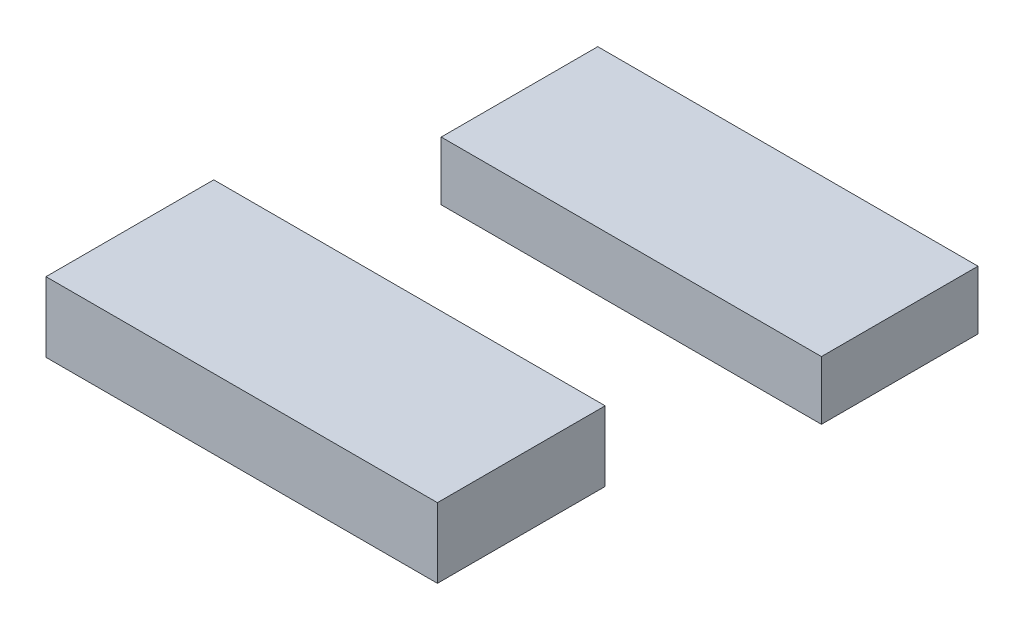
ISO-10303-21;
HEADER;
FILE_DESCRIPTION(('STEP AP214'),'2;1');
FILE_NAME('part.step','',(''),(''),'','','');
FILE_SCHEMA(('AUTOMOTIVE_DESIGN { 1 0 10303 214 1 1 1 1 }'));
ENDSEC;
DATA;
#1=APPLICATION_CONTEXT('core data for automotive mechanical design processes');
#2=APPLICATION_PROTOCOL_DEFINITION('international standard','automotive_design',2000,#1);
#3=PRODUCT_CONTEXT('',#1,'mechanical');
#4=PRODUCT('Part','Part','',(#3));
#5=PRODUCT_RELATED_PRODUCT_CATEGORY('part','',(#4));
#6=PRODUCT_DEFINITION_FORMATION('','',#4);
#7=PRODUCT_DEFINITION_CONTEXT('part definition',#1,'design');
#8=PRODUCT_DEFINITION('design','',#6,#7);
#9=PRODUCT_DEFINITION_SHAPE('','',#8);
#10=(LENGTH_UNIT() NAMED_UNIT(*) SI_UNIT(.MILLI.,.METRE.));
#11=(NAMED_UNIT(*) PLANE_ANGLE_UNIT() SI_UNIT($,.RADIAN.));
#12=(NAMED_UNIT(*) SI_UNIT($,.STERADIAN.) SOLID_ANGLE_UNIT());
#13=UNCERTAINTY_MEASURE_WITH_UNIT(LENGTH_MEASURE(1.E-05),#10,'distance_accuracy_value','');
#14=(GEOMETRIC_REPRESENTATION_CONTEXT(3) GLOBAL_UNCERTAINTY_ASSIGNED_CONTEXT((#13)) GLOBAL_UNIT_ASSIGNED_CONTEXT((#10,
#11,#12)) REPRESENTATION_CONTEXT('',''));
#15=CARTESIAN_POINT('',(0.,0.,0.));
#16=DIRECTION('',(0.,0.,1.));
#17=DIRECTION('',(1.,0.,0.));
#18=AXIS2_PLACEMENT_3D('',#15,#16,#17);
#19=CARTESIAN_POINT('',(-21.2858695042973,2.1,-19.7713435253592));
#20=DIRECTION('',(1.,0.,0.));
#21=DIRECTION('',(0.,0.,-1.));
#22=AXIS2_PLACEMENT_3D('',#19,#20,#21);
#23=PLANE('',#22);
#24=DIRECTION('',(0.,0.,1.));
#25=VECTOR('',#24,1.);
#26=CARTESIAN_POINT('',(-21.2858695042973,0.,-19.7713435253592));
#27=LINE('',#26,#25);
#28=CARTESIAN_POINT('',(-21.2858695042973,0.,-25.3713435253592));
#29=VERTEX_POINT('',#28);
#30=CARTESIAN_POINT('',(-21.2858695042973,0.,-19.7713435253592));
#31=VERTEX_POINT('',#30);
#32=EDGE_CURVE('E107',#29,#31,#27,.T.);
#33=ORIENTED_EDGE('',*,*,#32,.T.);
#34=DIRECTION('',(0.,-1.,0.));
#35=VECTOR('',#34,1.);
#36=CARTESIAN_POINT('',(-21.2858695042973,2.1,-19.7713435253592));
#37=LINE('',#36,#35);
#38=CARTESIAN_POINT('',(-21.2858695042973,2.1,-19.7713435253592));
#39=VERTEX_POINT('',#38);
#40=EDGE_CURVE('E12',#39,#31,#37,.T.);
#41=ORIENTED_EDGE('',*,*,#40,.F.);
#42=DIRECTION('',(0.,0.,1.));
#43=VECTOR('',#42,1.);
#44=CARTESIAN_POINT('',(-21.2858695042973,2.1,-19.7713435253592));
#45=LINE('',#44,#43);
#46=CARTESIAN_POINT('',(-21.2858695042973,2.1,-25.3713435253592));
#47=VERTEX_POINT('',#46);
#48=EDGE_CURVE('E95',#47,#39,#45,.T.);
#49=ORIENTED_EDGE('',*,*,#48,.F.);
#50=DIRECTION('',(0.,-1.,0.));
#51=VECTOR('',#50,1.);
#52=CARTESIAN_POINT('',(-21.2858695042973,2.1,-25.3713435253592));
#53=LINE('',#52,#51);
#54=EDGE_CURVE('E103',#47,#29,#53,.T.);
#55=ORIENTED_EDGE('',*,*,#54,.T.);
#56=EDGE_LOOP('',(#33,#41,#49,#55));
#57=FACE_BOUND('',#56,.T.);
#58=ADVANCED_FACE('F44',(#57),#23,.F.);
#59=CARTESIAN_POINT('',(-21.2858695042973,2.1,-19.7713435253592));
#60=DIRECTION('',(0.,0.,-1.));
#61=DIRECTION('',(-1.,0.,0.));
#62=AXIS2_PLACEMENT_3D('',#59,#60,#61);
#63=PLANE('',#62);
#64=DIRECTION('',(1.,0.,0.));
#65=VECTOR('',#64,1.);
#66=CARTESIAN_POINT('',(-21.2858695042973,0.,-19.7713435253592));
#67=LINE('',#66,#65);
#68=CARTESIAN_POINT('',(-7.68586950429731,0.,-19.7713435253592));
#69=VERTEX_POINT('',#68);
#70=EDGE_CURVE('E99',#31,#69,#67,.T.);
#71=ORIENTED_EDGE('',*,*,#70,.T.);
#72=DIRECTION('',(0.,-1.,0.));
#73=VECTOR('',#72,1.);
#74=CARTESIAN_POINT('',(-7.68586950429731,2.1,-19.7713435253592));
#75=LINE('',#74,#73);
#76=CARTESIAN_POINT('',(-7.68586950429731,2.1,-19.7713435253592));
#77=VERTEX_POINT('',#76);
#78=EDGE_CURVE('E52',#77,#69,#75,.T.);
#79=ORIENTED_EDGE('',*,*,#78,.F.);
#80=DIRECTION('',(1.,0.,0.));
#81=VECTOR('',#80,1.);
#82=CARTESIAN_POINT('',(-21.2858695042973,2.1,-19.7713435253592));
#83=LINE('',#82,#81);
#84=EDGE_CURVE('E90',#39,#77,#83,.T.);
#85=ORIENTED_EDGE('',*,*,#84,.F.);
#86=ORIENTED_EDGE('',*,*,#40,.T.);
#87=EDGE_LOOP('',(#71,#79,#85,#86));
#88=FACE_BOUND('',#87,.T.);
#89=ADVANCED_FACE('F98',(#88),#63,.F.);
#90=CARTESIAN_POINT('',(-7.68586950429731,2.1,-19.7713435253592));
#91=DIRECTION('',(-1.,0.,0.));
#92=DIRECTION('',(0.,0.,1.));
#93=AXIS2_PLACEMENT_3D('',#90,#91,#92);
#94=PLANE('',#93);
#95=DIRECTION('',(0.,0.,-1.));
#96=VECTOR('',#95,1.);
#97=CARTESIAN_POINT('',(-7.68586950429731,0.,-19.7713435253592));
#98=LINE('',#97,#96);
#99=CARTESIAN_POINT('',(-7.68586950429731,0.,-25.3713435253592));
#100=VERTEX_POINT('',#99);
#101=EDGE_CURVE('E77',#69,#100,#98,.T.);
#102=ORIENTED_EDGE('',*,*,#101,.T.);
#103=DIRECTION('',(0.,-1.,0.));
#104=VECTOR('',#103,1.);
#105=CARTESIAN_POINT('',(-7.68586950429731,2.1,-25.3713435253592));
#106=LINE('',#105,#104);
#107=CARTESIAN_POINT('',(-7.68586950429731,2.1,-25.3713435253592));
#108=VERTEX_POINT('',#107);
#109=EDGE_CURVE('E100',#108,#100,#106,.T.);
#110=ORIENTED_EDGE('',*,*,#109,.F.);
#111=DIRECTION('',(0.,0.,-1.));
#112=VECTOR('',#111,1.);
#113=CARTESIAN_POINT('',(-7.68586950429731,2.1,-19.7713435253592));
#114=LINE('',#113,#112);
#115=EDGE_CURVE('E93',#77,#108,#114,.T.);
#116=ORIENTED_EDGE('',*,*,#115,.F.);
#117=ORIENTED_EDGE('',*,*,#78,.T.);
#118=EDGE_LOOP('',(#102,#110,#116,#117));
#119=FACE_BOUND('',#118,.T.);
#120=ADVANCED_FACE('F101',(#119),#94,.F.);
#121=CARTESIAN_POINT('',(-21.2858695042973,2.1,-25.3713435253592));
#122=DIRECTION('',(0.,0.,1.));
#123=DIRECTION('',(1.,0.,0.));
#124=AXIS2_PLACEMENT_3D('',#121,#122,#123);
#125=PLANE('',#124);
#126=DIRECTION('',(-1.,0.,0.));
#127=VECTOR('',#126,1.);
#128=CARTESIAN_POINT('',(-21.2858695042973,0.,-25.3713435253592));
#129=LINE('',#128,#127);
#130=EDGE_CURVE('E83',#100,#29,#129,.T.);
#131=ORIENTED_EDGE('',*,*,#130,.T.);
#132=ORIENTED_EDGE('',*,*,#54,.F.);
#133=DIRECTION('',(-1.,0.,0.));
#134=VECTOR('',#133,1.);
#135=CARTESIAN_POINT('',(-21.2858695042973,2.1,-25.3713435253592));
#136=LINE('',#135,#134);
#137=EDGE_CURVE('E60',#108,#47,#136,.T.);
#138=ORIENTED_EDGE('',*,*,#137,.F.);
#139=ORIENTED_EDGE('',*,*,#109,.T.);
#140=EDGE_LOOP('',(#131,#132,#138,#139));
#141=FACE_BOUND('',#140,.T.);
#142=ADVANCED_FACE('F114',(#141),#125,.F.);
#143=CARTESIAN_POINT('',(0.,2.1,0.));
#144=DIRECTION('',(0.,-1.,0.));
#145=DIRECTION('',(0.,0.,-1.));
#146=AXIS2_PLACEMENT_3D('',#143,#144,#145);
#147=PLANE('',#146);
#148=ORIENTED_EDGE('',*,*,#48,.T.);
#149=ORIENTED_EDGE('',*,*,#84,.T.);
#150=ORIENTED_EDGE('',*,*,#115,.T.);
#151=ORIENTED_EDGE('',*,*,#137,.T.);
#152=EDGE_LOOP('',(#148,#149,#150,#151));
#153=FACE_BOUND('',#152,.T.);
#154=ADVANCED_FACE('F91',(#153),#147,.F.);
#155=CARTESIAN_POINT('',(0.,0.,0.));
#156=DIRECTION('',(0.,-1.,0.));
#157=DIRECTION('',(0.,0.,-1.));
#158=AXIS2_PLACEMENT_3D('',#155,#156,#157);
#159=PLANE('',#158);
#160=ORIENTED_EDGE('',*,*,#32,.F.);
#161=ORIENTED_EDGE('',*,*,#130,.F.);
#162=ORIENTED_EDGE('',*,*,#101,.F.);
#163=ORIENTED_EDGE('',*,*,#70,.F.);
#164=EDGE_LOOP('',(#160,#161,#162,#163));
#165=FACE_BOUND('',#164,.T.);
#166=ADVANCED_FACE('F117',(#165),#159,.T.);
#167=CLOSED_SHELL('',(#58,#89,#120,#142,#154,#166));
#168=MANIFOLD_SOLID_BREP('B2',#167);
#169=CARTESIAN_POINT('',(-9.62867686135496,2.5,-13.9786017772293));
#170=DIRECTION('',(-1.,0.,0.));
#171=DIRECTION('',(0.,0.,1.));
#172=AXIS2_PLACEMENT_3D('',#169,#170,#171);
#173=PLANE('',#172);
#174=DIRECTION('',(0.,0.,-1.));
#175=VECTOR('',#174,1.);
#176=CARTESIAN_POINT('',(-9.62867686135496,0.,-13.9786017772293));
#177=LINE('',#176,#175);
#178=CARTESIAN_POINT('',(-9.62867686135496,0.,-7.97860177722928));
#179=VERTEX_POINT('',#178);
#180=CARTESIAN_POINT('',(-9.62867686135496,0.,-13.9786017772293));
#181=VERTEX_POINT('',#180);
#182=EDGE_CURVE('E230',#179,#181,#177,.T.);
#183=ORIENTED_EDGE('',*,*,#182,.T.);
#184=DIRECTION('',(0.,-1.,0.));
#185=VECTOR('',#184,1.);
#186=CARTESIAN_POINT('',(-9.62867686135496,2.5,-13.9786017772293));
#187=LINE('',#186,#185);
#188=CARTESIAN_POINT('',(-9.62867686135496,2.5,-13.9786017772293));
#189=VERTEX_POINT('',#188);
#190=EDGE_CURVE('E42',#189,#181,#187,.T.);
#191=ORIENTED_EDGE('',*,*,#190,.F.);
#192=DIRECTION('',(0.,0.,-1.));
#193=VECTOR('',#192,1.);
#194=CARTESIAN_POINT('',(-9.62867686135496,2.5,-13.9786017772293));
#195=LINE('',#194,#193);
#196=CARTESIAN_POINT('',(-9.62867686135496,2.5,-7.97860177722928));
#197=VERTEX_POINT('',#196);
#198=EDGE_CURVE('E218',#197,#189,#195,.T.);
#199=ORIENTED_EDGE('',*,*,#198,.F.);
#200=DIRECTION('',(0.,-1.,0.));
#201=VECTOR('',#200,1.);
#202=CARTESIAN_POINT('',(-9.62867686135496,2.5,-7.97860177722928));
#203=LINE('',#202,#201);
#204=EDGE_CURVE('E226',#197,#179,#203,.T.);
#205=ORIENTED_EDGE('',*,*,#204,.T.);
#206=EDGE_LOOP('',(#183,#191,#199,#205));
#207=FACE_BOUND('',#206,.T.);
#208=ADVANCED_FACE('F167',(#207),#173,.F.);
#209=CARTESIAN_POINT('',(-23.628676861355,2.5,-13.9786017772293));
#210=DIRECTION('',(0.,0.,1.));
#211=DIRECTION('',(1.,0.,0.));
#212=AXIS2_PLACEMENT_3D('',#209,#210,#211);
#213=PLANE('',#212);
#214=DIRECTION('',(-1.,0.,0.));
#215=VECTOR('',#214,1.);
#216=CARTESIAN_POINT('',(-23.628676861355,0.,-13.9786017772293));
#217=LINE('',#216,#215);
#218=CARTESIAN_POINT('',(-23.628676861355,0.,-13.9786017772293));
#219=VERTEX_POINT('',#218);
#220=EDGE_CURVE('E222',#181,#219,#217,.T.);
#221=ORIENTED_EDGE('',*,*,#220,.T.);
#222=DIRECTION('',(0.,-1.,0.));
#223=VECTOR('',#222,1.);
#224=CARTESIAN_POINT('',(-23.628676861355,2.5,-13.9786017772293));
#225=LINE('',#224,#223);
#226=CARTESIAN_POINT('',(-23.628676861355,2.5,-13.9786017772293));
#227=VERTEX_POINT('',#226);
#228=EDGE_CURVE('E175',#227,#219,#225,.T.);
#229=ORIENTED_EDGE('',*,*,#228,.F.);
#230=DIRECTION('',(-1.,0.,0.));
#231=VECTOR('',#230,1.);
#232=CARTESIAN_POINT('',(-23.628676861355,2.5,-13.9786017772293));
#233=LINE('',#232,#231);
#234=EDGE_CURVE('E213',#189,#227,#233,.T.);
#235=ORIENTED_EDGE('',*,*,#234,.F.);
#236=ORIENTED_EDGE('',*,*,#190,.T.);
#237=EDGE_LOOP('',(#221,#229,#235,#236));
#238=FACE_BOUND('',#237,.T.);
#239=ADVANCED_FACE('F221',(#238),#213,.F.);
#240=CARTESIAN_POINT('',(-23.628676861355,2.5,-13.9786017772293));
#241=DIRECTION('',(1.,0.,0.));
#242=DIRECTION('',(0.,0.,-1.));
#243=AXIS2_PLACEMENT_3D('',#240,#241,#242);
#244=PLANE('',#243);
#245=DIRECTION('',(0.,0.,1.));
#246=VECTOR('',#245,1.);
#247=CARTESIAN_POINT('',(-23.628676861355,0.,-13.9786017772293));
#248=LINE('',#247,#246);
#249=CARTESIAN_POINT('',(-23.628676861355,0.,-7.97860177722928));
#250=VERTEX_POINT('',#249);
#251=EDGE_CURVE('E200',#219,#250,#248,.T.);
#252=ORIENTED_EDGE('',*,*,#251,.T.);
#253=DIRECTION('',(0.,-1.,0.));
#254=VECTOR('',#253,1.);
#255=CARTESIAN_POINT('',(-23.628676861355,2.5,-7.97860177722928));
#256=LINE('',#255,#254);
#257=CARTESIAN_POINT('',(-23.628676861355,2.5,-7.97860177722928));
#258=VERTEX_POINT('',#257);
#259=EDGE_CURVE('E223',#258,#250,#256,.T.);
#260=ORIENTED_EDGE('',*,*,#259,.F.);
#261=DIRECTION('',(0.,0.,1.));
#262=VECTOR('',#261,1.);
#263=CARTESIAN_POINT('',(-23.628676861355,2.5,-13.9786017772293));
#264=LINE('',#263,#262);
#265=EDGE_CURVE('E216',#227,#258,#264,.T.);
#266=ORIENTED_EDGE('',*,*,#265,.F.);
#267=ORIENTED_EDGE('',*,*,#228,.T.);
#268=EDGE_LOOP('',(#252,#260,#266,#267));
#269=FACE_BOUND('',#268,.T.);
#270=ADVANCED_FACE('F224',(#269),#244,.F.);
#271=CARTESIAN_POINT('',(-23.628676861355,2.5,-7.97860177722928));
#272=DIRECTION('',(0.,0.,-1.));
#273=DIRECTION('',(-1.,0.,0.));
#274=AXIS2_PLACEMENT_3D('',#271,#272,#273);
#275=PLANE('',#274);
#276=DIRECTION('',(1.,0.,0.));
#277=VECTOR('',#276,1.);
#278=CARTESIAN_POINT('',(-23.628676861355,0.,-7.97860177722928));
#279=LINE('',#278,#277);
#280=EDGE_CURVE('E206',#250,#179,#279,.T.);
#281=ORIENTED_EDGE('',*,*,#280,.T.);
#282=ORIENTED_EDGE('',*,*,#204,.F.);
#283=DIRECTION('',(1.,0.,0.));
#284=VECTOR('',#283,1.);
#285=CARTESIAN_POINT('',(-23.628676861355,2.5,-7.97860177722928));
#286=LINE('',#285,#284);
#287=EDGE_CURVE('E183',#258,#197,#286,.T.);
#288=ORIENTED_EDGE('',*,*,#287,.F.);
#289=ORIENTED_EDGE('',*,*,#259,.T.);
#290=EDGE_LOOP('',(#281,#282,#288,#289));
#291=FACE_BOUND('',#290,.T.);
#292=ADVANCED_FACE('F237',(#291),#275,.F.);
#293=CARTESIAN_POINT('',(0.,2.5,0.));
#294=DIRECTION('',(0.,1.,0.));
#295=DIRECTION('',(0.,0.,1.));
#296=AXIS2_PLACEMENT_3D('',#293,#294,#295);
#297=PLANE('',#296);
#298=ORIENTED_EDGE('',*,*,#198,.T.);
#299=ORIENTED_EDGE('',*,*,#234,.T.);
#300=ORIENTED_EDGE('',*,*,#265,.T.);
#301=ORIENTED_EDGE('',*,*,#287,.T.);
#302=EDGE_LOOP('',(#298,#299,#300,#301));
#303=FACE_BOUND('',#302,.T.);
#304=ADVANCED_FACE('F214',(#303),#297,.T.);
#305=CARTESIAN_POINT('',(0.,0.,0.));
#306=DIRECTION('',(0.,1.,0.));
#307=DIRECTION('',(0.,0.,1.));
#308=AXIS2_PLACEMENT_3D('',#305,#306,#307);
#309=PLANE('',#308);
#310=ORIENTED_EDGE('',*,*,#182,.F.);
#311=ORIENTED_EDGE('',*,*,#280,.F.);
#312=ORIENTED_EDGE('',*,*,#251,.F.);
#313=ORIENTED_EDGE('',*,*,#220,.F.);
#314=EDGE_LOOP('',(#310,#311,#312,#313));
#315=FACE_BOUND('',#314,.T.);
#316=ADVANCED_FACE('F240',(#315),#309,.F.);
#317=CLOSED_SHELL('',(#208,#239,#270,#292,#304,#316));
#318=MANIFOLD_SOLID_BREP('B6',#317);
#319=ADVANCED_BREP_SHAPE_REPRESENTATION('',(#18,#168,#318),#14);
#320=SHAPE_DEFINITION_REPRESENTATION(#9,#319);
ENDSEC;
END-ISO-10303-21;
